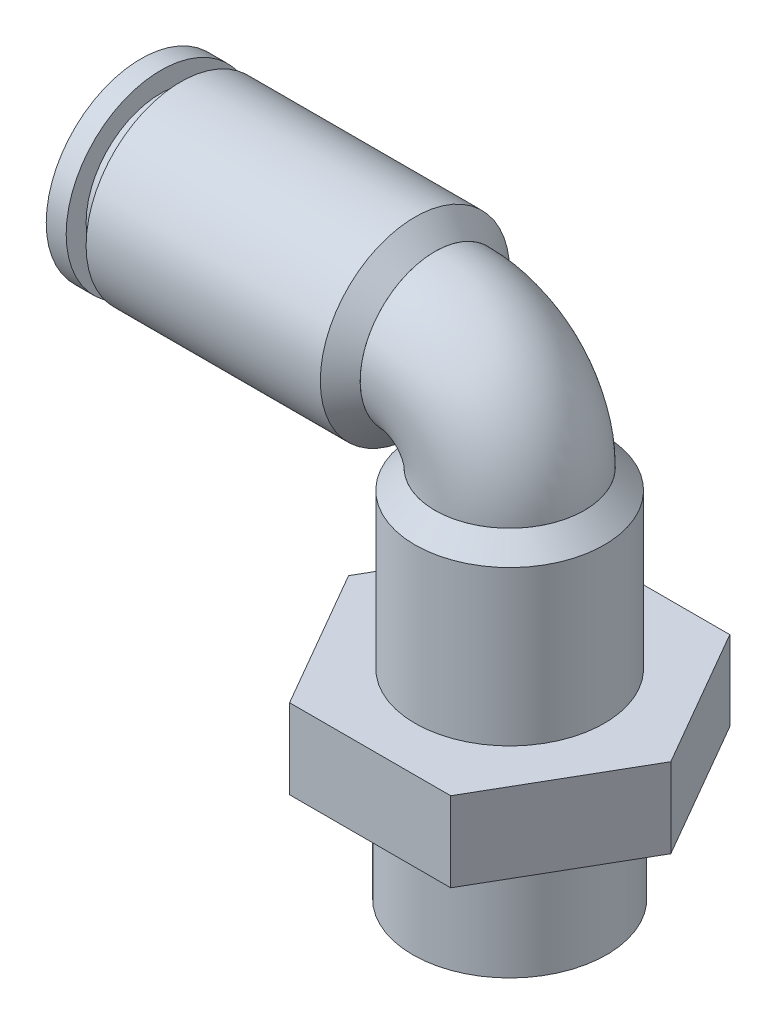
ISO-10303-21;
HEADER;
FILE_DESCRIPTION(('STEP AP214'),'2;1');
FILE_NAME('part.step','',(''),(''),'','','');
FILE_SCHEMA(('AUTOMOTIVE_DESIGN { 1 0 10303 214 1 1 1 1 }'));
ENDSEC;
DATA;
#1=APPLICATION_CONTEXT('core data for automotive mechanical design processes');
#2=APPLICATION_PROTOCOL_DEFINITION('international standard','automotive_design',2000,#1);
#3=PRODUCT_CONTEXT('',#1,'mechanical');
#4=PRODUCT('Part','Part','',(#3));
#5=PRODUCT_RELATED_PRODUCT_CATEGORY('part','',(#4));
#6=PRODUCT_DEFINITION_FORMATION('','',#4);
#7=PRODUCT_DEFINITION_CONTEXT('part definition',#1,'design');
#8=PRODUCT_DEFINITION('design','',#6,#7);
#9=PRODUCT_DEFINITION_SHAPE('','',#8);
#10=(LENGTH_UNIT() NAMED_UNIT(*) SI_UNIT(.MILLI.,.METRE.));
#11=(NAMED_UNIT(*) PLANE_ANGLE_UNIT() SI_UNIT($,.RADIAN.));
#12=(NAMED_UNIT(*) SI_UNIT($,.STERADIAN.) SOLID_ANGLE_UNIT());
#13=UNCERTAINTY_MEASURE_WITH_UNIT(LENGTH_MEASURE(1.E-05),#10,'distance_accuracy_value','');
#14=(GEOMETRIC_REPRESENTATION_CONTEXT(3) GLOBAL_UNCERTAINTY_ASSIGNED_CONTEXT((#13)) GLOBAL_UNIT_ASSIGNED_CONTEXT((#10,
#11,#12)) REPRESENTATION_CONTEXT('',''));
#15=CARTESIAN_POINT('',(0.,0.,0.));
#16=DIRECTION('',(0.,0.,1.));
#17=DIRECTION('',(1.,0.,0.));
#18=AXIS2_PLACEMENT_3D('',#15,#16,#17);
#19=CARTESIAN_POINT('',(-18.5,0.,0.));
#20=DIRECTION('',(-1.,0.,0.));
#21=DIRECTION('',(0.,0.,1.));
#22=AXIS2_PLACEMENT_3D('',#19,#20,#21);
#23=CYLINDRICAL_SURFACE('',#22,4.75);
#24=CARTESIAN_POINT('',(-17.5,0.,0.));
#25=DIRECTION('',(-1.,0.,0.));
#26=DIRECTION('',(0.,0.,1.));
#27=AXIS2_PLACEMENT_3D('',#24,#25,#26);
#28=CIRCLE('',#27,4.75);
#29=CARTESIAN_POINT('',(-17.5,0.,4.75));
#30=VERTEX_POINT('',#29);
#31=EDGE_CURVE('P0_E10',#30,#30,#28,.T.);
#32=ORIENTED_EDGE('',*,*,#31,.T.);
#33=EDGE_LOOP('',(#32));
#34=FACE_BOUND('',#33,.T.);
#35=CARTESIAN_POINT('',(-18.5,0.,0.));
#36=DIRECTION('',(-1.,0.,0.));
#37=DIRECTION('',(0.,0.,1.));
#38=AXIS2_PLACEMENT_3D('',#35,#36,#37);
#39=CIRCLE('',#38,4.75);
#40=CARTESIAN_POINT('',(-18.5,0.,4.75));
#41=VERTEX_POINT('',#40);
#42=EDGE_CURVE('P0_E39',#41,#41,#39,.T.);
#43=ORIENTED_EDGE('',*,*,#42,.F.);
#44=EDGE_LOOP('',(#43));
#45=FACE_BOUND('',#44,.T.);
#46=ADVANCED_FACE('P0_F14',(#34,#45),#23,.T.);
#47=CARTESIAN_POINT('',(-17.5,-4.75,0.));
#48=DIRECTION('',(1.,0.,0.));
#49=DIRECTION('',(0.,0.,-1.));
#50=AXIS2_PLACEMENT_3D('',#47,#48,#49);
#51=PLANE('',#50);
#52=CARTESIAN_POINT('',(-17.5,0.,0.));
#53=DIRECTION('',(-1.,0.,0.));
#54=DIRECTION('',(0.,0.,1.));
#55=AXIS2_PLACEMENT_3D('',#52,#53,#54);
#56=CIRCLE('',#55,3.75);
#57=CARTESIAN_POINT('',(-17.5,0.,3.75));
#58=VERTEX_POINT('',#57);
#59=EDGE_CURVE('P0_E20',#58,#58,#56,.T.);
#60=ORIENTED_EDGE('',*,*,#59,.T.);
#61=EDGE_LOOP('',(#60));
#62=FACE_BOUND('',#61,.T.);
#63=ORIENTED_EDGE('',*,*,#31,.F.);
#64=EDGE_LOOP('',(#63));
#65=FACE_BOUND('',#64,.T.);
#66=ADVANCED_FACE('P0_F59',(#62,#65),#51,.T.);
#67=CARTESIAN_POINT('',(-18.5,0.,0.));
#68=DIRECTION('',(-1.,0.,0.));
#69=DIRECTION('',(0.,0.,1.));
#70=AXIS2_PLACEMENT_3D('',#67,#68,#69);
#71=CYLINDRICAL_SURFACE('',#70,3.75);
#72=CARTESIAN_POINT('',(-16.5,0.,0.));
#73=DIRECTION('',(-1.,0.,0.));
#74=DIRECTION('',(0.,0.,1.));
#75=AXIS2_PLACEMENT_3D('',#72,#73,#74);
#76=CIRCLE('',#75,3.75);
#77=CARTESIAN_POINT('',(-16.5,0.,3.75));
#78=VERTEX_POINT('',#77);
#79=EDGE_CURVE('P0_E24',#78,#78,#76,.T.);
#80=ORIENTED_EDGE('',*,*,#79,.T.);
#81=EDGE_LOOP('',(#80));
#82=FACE_BOUND('',#81,.T.);
#83=ORIENTED_EDGE('',*,*,#59,.F.);
#84=EDGE_LOOP('',(#83));
#85=FACE_BOUND('',#84,.T.);
#86=ADVANCED_FACE('P0_F64',(#82,#85),#71,.T.);
#87=CARTESIAN_POINT('',(-16.5,-3.75,0.));
#88=DIRECTION('',(-1.,0.,0.));
#89=DIRECTION('',(0.,0.,1.));
#90=AXIS2_PLACEMENT_3D('',#87,#88,#89);
#91=PLANE('',#90);
#92=CARTESIAN_POINT('',(-16.5,0.,0.));
#93=DIRECTION('',(-1.,0.,0.));
#94=DIRECTION('',(0.,0.,1.));
#95=AXIS2_PLACEMENT_3D('',#92,#93,#94);
#96=CIRCLE('',#95,4.75);
#97=CARTESIAN_POINT('',(-16.5,0.,4.75));
#98=VERTEX_POINT('',#97);
#99=EDGE_CURVE('P0_E28',#98,#98,#96,.T.);
#100=ORIENTED_EDGE('',*,*,#99,.T.);
#101=EDGE_LOOP('',(#100));
#102=FACE_BOUND('',#101,.T.);
#103=ORIENTED_EDGE('',*,*,#79,.F.);
#104=EDGE_LOOP('',(#103));
#105=FACE_BOUND('',#104,.T.);
#106=ADVANCED_FACE('P0_F68',(#102,#105),#91,.T.);
#107=CARTESIAN_POINT('',(-18.5,0.,0.));
#108=DIRECTION('',(-1.,0.,0.));
#109=DIRECTION('',(0.,0.,1.));
#110=AXIS2_PLACEMENT_3D('',#107,#108,#109);
#111=CYLINDRICAL_SURFACE('',#110,4.75);
#112=CARTESIAN_POINT('',(-4.75,0.,0.));
#113=DIRECTION('',(-1.,0.,0.));
#114=DIRECTION('',(0.,0.,1.));
#115=AXIS2_PLACEMENT_3D('',#112,#113,#114);
#116=CIRCLE('',#115,4.75);
#117=CARTESIAN_POINT('',(-4.75,0.,4.75));
#118=VERTEX_POINT('',#117);
#119=EDGE_CURVE('P0_E33',#118,#118,#116,.T.);
#120=ORIENTED_EDGE('',*,*,#119,.T.);
#121=EDGE_LOOP('',(#120));
#122=FACE_BOUND('',#121,.T.);
#123=ORIENTED_EDGE('',*,*,#99,.F.);
#124=EDGE_LOOP('',(#123));
#125=FACE_BOUND('',#124,.T.);
#126=ADVANCED_FACE('P0_F75',(#122,#125),#111,.T.);
#127=CARTESIAN_POINT('',(-4.75,0.,0.));
#128=DIRECTION('',(-1.,0.,0.));
#129=DIRECTION('',(0.,0.,1.));
#130=AXIS2_PLACEMENT_3D('',#127,#128,#129);
#131=CONICAL_SURFACE('',#130,4.75,0.78539816339745);
#132=CARTESIAN_POINT('',(-3.75,0.,0.));
#133=DIRECTION('',(-1.,0.,0.));
#134=DIRECTION('',(0.,0.,1.));
#135=AXIS2_PLACEMENT_3D('',#132,#133,#134);
#136=CIRCLE('',#135,3.75);
#137=CARTESIAN_POINT('',(-3.75,0.,3.75));
#138=VERTEX_POINT('',#137);
#139=EDGE_CURVE('P0_E36',#138,#138,#136,.T.);
#140=ORIENTED_EDGE('',*,*,#139,.T.);
#141=EDGE_LOOP('',(#140));
#142=FACE_BOUND('',#141,.T.);
#143=ORIENTED_EDGE('',*,*,#119,.F.);
#144=EDGE_LOOP('',(#143));
#145=FACE_BOUND('',#144,.T.);
#146=ADVANCED_FACE('P0_F79',(#142,#145),#131,.T.);
#147=CARTESIAN_POINT('',(-3.75,-3.75,0.));
#148=DIRECTION('',(1.,0.,0.));
#149=DIRECTION('',(0.,0.,-1.));
#150=AXIS2_PLACEMENT_3D('',#147,#148,#149);
#151=PLANE('',#150);
#152=CARTESIAN_POINT('',(-3.75,0.,0.));
#153=DIRECTION('',(1.,0.,0.));
#154=DIRECTION('',(0.,0.,-1.));
#155=AXIS2_PLACEMENT_3D('',#152,#153,#154);
#156=CIRCLE('',#155,2.);
#157=CARTESIAN_POINT('',(-3.75,0.,-2.));
#158=VERTEX_POINT('',#157);
#159=EDGE_CURVE('P0_E42',#158,#158,#156,.T.);
#160=ORIENTED_EDGE('',*,*,#159,.F.);
#161=EDGE_LOOP('',(#160));
#162=FACE_BOUND('',#161,.T.);
#163=ORIENTED_EDGE('',*,*,#139,.F.);
#164=EDGE_LOOP('',(#163));
#165=FACE_BOUND('',#164,.T.);
#166=ADVANCED_FACE('P0_F54',(#162,#165),#151,.T.);
#167=CARTESIAN_POINT('',(-18.5,0.,0.));
#168=DIRECTION('',(-1.,0.,0.));
#169=DIRECTION('',(0.,0.,1.));
#170=AXIS2_PLACEMENT_3D('',#167,#168,#169);
#171=PLANE('',#170);
#172=CARTESIAN_POINT('',(-18.5,0.,0.));
#173=DIRECTION('',(-1.,0.,0.));
#174=DIRECTION('',(0.,0.,1.));
#175=AXIS2_PLACEMENT_3D('',#172,#173,#174);
#176=CIRCLE('',#175,2.);
#177=CARTESIAN_POINT('',(-18.5,0.,2.));
#178=VERTEX_POINT('',#177);
#179=EDGE_CURVE('P0_E45',#178,#178,#176,.T.);
#180=ORIENTED_EDGE('',*,*,#179,.F.);
#181=EDGE_LOOP('',(#180));
#182=FACE_BOUND('',#181,.T.);
#183=ORIENTED_EDGE('',*,*,#42,.T.);
#184=EDGE_LOOP('',(#183));
#185=FACE_BOUND('',#184,.T.);
#186=ADVANCED_FACE('P0_F51',(#182,#185),#171,.T.);
#187=CARTESIAN_POINT('',(-1.5,0.,0.));
#188=DIRECTION('',(-1.,0.,0.));
#189=DIRECTION('',(0.,0.,1.));
#190=AXIS2_PLACEMENT_3D('',#187,#188,#189);
#191=CYLINDRICAL_SURFACE('',#190,2.);
#192=ORIENTED_EDGE('',*,*,#159,.T.);
#193=EDGE_LOOP('',(#192));
#194=FACE_BOUND('',#193,.T.);
#195=ORIENTED_EDGE('',*,*,#179,.T.);
#196=EDGE_LOOP('',(#195));
#197=FACE_BOUND('',#196,.T.);
#198=ADVANCED_FACE('P0_F49',(#194,#197),#191,.F.);
#199=CLOSED_SHELL('',(#46,#66,#86,#106,#126,#146,#166,#186,#198));
#200=MANIFOLD_SOLID_BREP('P0_B1',#199);
#201=CARTESIAN_POINT('',(-9.,-16.5,0.));
#202=DIRECTION('',(0.,-1.,0.));
#203=DIRECTION('',(0.,0.,-1.));
#204=AXIS2_PLACEMENT_3D('',#201,#202,#203);
#205=PLANE('',#204);
#206=CARTESIAN_POINT('',(0.,-16.5,0.));
#207=DIRECTION('',(0.,1.,0.));
#208=DIRECTION('',(0.,0.,1.));
#209=AXIS2_PLACEMENT_3D('',#206,#207,#208);
#210=CIRCLE('',#209,4.864);
#211=CARTESIAN_POINT('',(0.,-16.5,4.864));
#212=VERTEX_POINT('',#211);
#213=EDGE_CURVE('P1_E25',#212,#212,#210,.T.);
#214=ORIENTED_EDGE('',*,*,#213,.T.);
#215=EDGE_LOOP('',(#214));
#216=FACE_BOUND('',#215,.T.);
#217=DIRECTION('',(1.,0.,0.));
#218=VECTOR('',#217,1.);
#219=CARTESIAN_POINT('',(-4.04145188432738,-16.5,-7.));
#220=LINE('',#219,#218);
#221=CARTESIAN_POINT('',(-4.04145188432738,-16.5,-7.));
#222=VERTEX_POINT('',#221);
#223=CARTESIAN_POINT('',(4.04145188432738,-16.5,-7.));
#224=VERTEX_POINT('',#223);
#225=EDGE_CURVE('P1_E106',#222,#224,#220,.T.);
#226=ORIENTED_EDGE('',*,*,#225,.T.);
#227=DIRECTION('',(0.5,0.,0.866025403784439));
#228=VECTOR('',#227,1.);
#229=CARTESIAN_POINT('',(4.04145188432738,-16.5,-7.));
#230=LINE('',#229,#228);
#231=CARTESIAN_POINT('',(8.08290376865476,-16.5,0.));
#232=VERTEX_POINT('',#231);
#233=EDGE_CURVE('P1_E72',#224,#232,#230,.T.);
#234=ORIENTED_EDGE('',*,*,#233,.T.);
#235=DIRECTION('',(-0.5,0.,0.866025403784438));
#236=VECTOR('',#235,1.);
#237=CARTESIAN_POINT('',(8.08290376865476,-16.5,0.));
#238=LINE('',#237,#236);
#239=CARTESIAN_POINT('',(4.04145188432738,-16.5,7.));
#240=VERTEX_POINT('',#239);
#241=EDGE_CURVE('P1_E84',#232,#240,#238,.T.);
#242=ORIENTED_EDGE('',*,*,#241,.T.);
#243=DIRECTION('',(-1.,0.,0.));
#244=VECTOR('',#243,1.);
#245=CARTESIAN_POINT('',(4.04145188432738,-16.5,7.));
#246=LINE('',#245,#244);
#247=CARTESIAN_POINT('',(-4.04145188432738,-16.5,7.));
#248=VERTEX_POINT('',#247);
#249=EDGE_CURVE('P1_E32',#240,#248,#246,.T.);
#250=ORIENTED_EDGE('',*,*,#249,.T.);
#251=DIRECTION('',(-0.5,0.,-0.866025403784439));
#252=VECTOR('',#251,1.);
#253=CARTESIAN_POINT('',(-4.04145188432738,-16.5,7.));
#254=LINE('',#253,#252);
#255=CARTESIAN_POINT('',(-8.08290376865476,-16.5,0.));
#256=VERTEX_POINT('',#255);
#257=EDGE_CURVE('P1_E112',#248,#256,#254,.T.);
#258=ORIENTED_EDGE('',*,*,#257,.T.);
#259=DIRECTION('',(0.5,0.,-0.866025403784438));
#260=VECTOR('',#259,1.);
#261=CARTESIAN_POINT('',(-8.08290376865476,-16.5,0.));
#262=LINE('',#261,#260);
#263=EDGE_CURVE('P1_E109',#256,#222,#262,.T.);
#264=ORIENTED_EDGE('',*,*,#263,.T.);
#265=EDGE_LOOP('',(#226,#234,#242,#250,#258,#264));
#266=FACE_BOUND('',#265,.T.);
#267=ADVANCED_FACE('P1_F16',(#216,#266),#205,.T.);
#268=CARTESIAN_POINT('',(-4.75,-12.5,0.));
#269=DIRECTION('',(0.,1.,0.));
#270=DIRECTION('',(0.,0.,1.));
#271=AXIS2_PLACEMENT_3D('',#268,#269,#270);
#272=PLANE('',#271);
#273=CARTESIAN_POINT('',(0.,-12.5,0.));
#274=DIRECTION('',(0.,1.,0.));
#275=DIRECTION('',(0.,0.,1.));
#276=AXIS2_PLACEMENT_3D('',#273,#274,#275);
#277=CIRCLE('',#276,4.75);
#278=CARTESIAN_POINT('',(0.,-12.5,4.75));
#279=VERTEX_POINT('',#278);
#280=EDGE_CURVE('P1_E125',#279,#279,#277,.T.);
#281=ORIENTED_EDGE('',*,*,#280,.F.);
#282=EDGE_LOOP('',(#281));
#283=FACE_BOUND('',#282,.T.);
#284=DIRECTION('',(-0.5,0.,0.866025403784439));
#285=VECTOR('',#284,1.);
#286=CARTESIAN_POINT('',(8.08290376865476,-12.5,0.));
#287=LINE('',#286,#285);
#288=CARTESIAN_POINT('',(8.08290376865476,-12.5,0.));
#289=VERTEX_POINT('',#288);
#290=CARTESIAN_POINT('',(4.04145188432738,-12.5,7.));
#291=VERTEX_POINT('',#290);
#292=EDGE_CURVE('P1_E90',#289,#291,#287,.T.);
#293=ORIENTED_EDGE('',*,*,#292,.F.);
#294=DIRECTION('',(0.5,0.,0.866025403784439));
#295=VECTOR('',#294,1.);
#296=CARTESIAN_POINT('',(4.04145188432738,-12.5,-7.));
#297=LINE('',#296,#295);
#298=CARTESIAN_POINT('',(4.04145188432738,-12.5,-7.));
#299=VERTEX_POINT('',#298);
#300=EDGE_CURVE('P1_E40',#299,#289,#297,.T.);
#301=ORIENTED_EDGE('',*,*,#300,.F.);
#302=DIRECTION('',(1.,0.,0.));
#303=VECTOR('',#302,1.);
#304=CARTESIAN_POINT('',(-4.04145188432739,-12.5,-7.));
#305=LINE('',#304,#303);
#306=CARTESIAN_POINT('',(-4.04145188432738,-12.5,-7.));
#307=VERTEX_POINT('',#306);
#308=EDGE_CURVE('P1_E78',#307,#299,#305,.T.);
#309=ORIENTED_EDGE('',*,*,#308,.F.);
#310=DIRECTION('',(0.5,0.,-0.866025403784439));
#311=VECTOR('',#310,1.);
#312=CARTESIAN_POINT('',(-8.08290376865476,-12.5,0.));
#313=LINE('',#312,#311);
#314=CARTESIAN_POINT('',(-8.08290376865476,-12.5,0.));
#315=VERTEX_POINT('',#314);
#316=EDGE_CURVE('P1_E97',#315,#307,#313,.T.);
#317=ORIENTED_EDGE('',*,*,#316,.F.);
#318=DIRECTION('',(-0.5,0.,-0.866025403784439));
#319=VECTOR('',#318,1.);
#320=CARTESIAN_POINT('',(-4.04145188432738,-12.5,7.));
#321=LINE('',#320,#319);
#322=CARTESIAN_POINT('',(-4.04145188432738,-12.5,7.));
#323=VERTEX_POINT('',#322);
#324=EDGE_CURVE('P1_E100',#323,#315,#321,.T.);
#325=ORIENTED_EDGE('',*,*,#324,.F.);
#326=DIRECTION('',(-1.,0.,0.));
#327=VECTOR('',#326,1.);
#328=CARTESIAN_POINT('',(4.04145188432737,-12.5,7.));
#329=LINE('',#328,#327);
#330=EDGE_CURVE('P1_E92',#291,#323,#329,.T.);
#331=ORIENTED_EDGE('',*,*,#330,.F.);
#332=EDGE_LOOP('',(#293,#301,#309,#317,#325,#331));
#333=FACE_BOUND('',#332,.T.);
#334=ADVANCED_FACE('P1_F87',(#283,#333),#272,.T.);
#335=CARTESIAN_POINT('',(-4.864,-22.5,0.));
#336=DIRECTION('',(0.,-1.,0.));
#337=DIRECTION('',(0.,0.,-1.));
#338=AXIS2_PLACEMENT_3D('',#335,#336,#337);
#339=PLANE('',#338);
#340=CARTESIAN_POINT('',(0.,-22.5,0.));
#341=DIRECTION('',(0.,1.,0.));
#342=DIRECTION('',(0.,0.,1.));
#343=AXIS2_PLACEMENT_3D('',#340,#341,#342);
#344=CIRCLE('',#343,1.5);
#345=CARTESIAN_POINT('',(0.,-22.5,1.5));
#346=VERTEX_POINT('',#345);
#347=EDGE_CURVE('P1_E99',#346,#346,#344,.T.);
#348=ORIENTED_EDGE('',*,*,#347,.T.);
#349=EDGE_LOOP('',(#348));
#350=FACE_BOUND('',#349,.T.);
#351=CARTESIAN_POINT('',(0.,-22.5,0.));
#352=DIRECTION('',(0.,1.,0.));
#353=DIRECTION('',(0.,0.,1.));
#354=AXIS2_PLACEMENT_3D('',#351,#352,#353);
#355=CIRCLE('',#354,4.864);
#356=CARTESIAN_POINT('',(0.,-22.5,4.864));
#357=VERTEX_POINT('',#356);
#358=EDGE_CURVE('P1_E11',#357,#357,#355,.T.);
#359=ORIENTED_EDGE('',*,*,#358,.F.);
#360=EDGE_LOOP('',(#359));
#361=FACE_BOUND('',#360,.T.);
#362=ADVANCED_FACE('P1_F18',(#350,#361),#339,.T.);
#363=CARTESIAN_POINT('',(0.,0.,0.));
#364=DIRECTION('',(0.,1.,0.));
#365=DIRECTION('',(0.,0.,1.));
#366=AXIS2_PLACEMENT_3D('',#363,#364,#365);
#367=CYLINDRICAL_SURFACE('',#366,4.864);
#368=ORIENTED_EDGE('',*,*,#358,.T.);
#369=EDGE_LOOP('',(#368));
#370=FACE_BOUND('',#369,.T.);
#371=ORIENTED_EDGE('',*,*,#213,.F.);
#372=EDGE_LOOP('',(#371));
#373=FACE_BOUND('',#372,.T.);
#374=ADVANCED_FACE('P1_F133',(#370,#373),#367,.T.);
#375=CARTESIAN_POINT('',(0.,0.,0.));
#376=DIRECTION('',(0.,1.,0.));
#377=DIRECTION('',(0.,0.,1.));
#378=AXIS2_PLACEMENT_3D('',#375,#376,#377);
#379=CYLINDRICAL_SURFACE('',#378,4.75);
#380=ORIENTED_EDGE('',*,*,#280,.T.);
#381=EDGE_LOOP('',(#380));
#382=FACE_BOUND('',#381,.T.);
#383=CARTESIAN_POINT('',(0.,-4.75,0.));
#384=DIRECTION('',(0.,1.,0.));
#385=DIRECTION('',(0.,0.,1.));
#386=AXIS2_PLACEMENT_3D('',#383,#384,#385);
#387=CIRCLE('',#386,4.75);
#388=CARTESIAN_POINT('',(0.,-4.75,4.75));
#389=VERTEX_POINT('',#388);
#390=EDGE_CURVE('P1_E122',#389,#389,#387,.T.);
#391=ORIENTED_EDGE('',*,*,#390,.F.);
#392=EDGE_LOOP('',(#391));
#393=FACE_BOUND('',#392,.T.);
#394=ADVANCED_FACE('P1_F135',(#382,#393),#379,.T.);
#395=CARTESIAN_POINT('',(0.,-3.75,0.));
#396=DIRECTION('',(0.,-1.,0.));
#397=DIRECTION('',(0.,0.,-1.));
#398=AXIS2_PLACEMENT_3D('',#395,#396,#397);
#399=CONICAL_SURFACE('',#398,3.75,0.785398163397447);
#400=ORIENTED_EDGE('',*,*,#390,.T.);
#401=EDGE_LOOP('',(#400));
#402=FACE_BOUND('',#401,.T.);
#403=CARTESIAN_POINT('',(0.,-3.75,0.));
#404=DIRECTION('',(0.,1.,0.));
#405=DIRECTION('',(0.,0.,1.));
#406=AXIS2_PLACEMENT_3D('',#403,#404,#405);
#407=CIRCLE('',#406,3.75);
#408=CARTESIAN_POINT('',(0.,-3.75,3.75));
#409=VERTEX_POINT('',#408);
#410=EDGE_CURVE('P1_E119',#409,#409,#407,.T.);
#411=ORIENTED_EDGE('',*,*,#410,.F.);
#412=EDGE_LOOP('',(#411));
#413=FACE_BOUND('',#412,.T.);
#414=ADVANCED_FACE('P1_F142',(#402,#413),#399,.T.);
#415=CARTESIAN_POINT('',(0.,-3.75,0.));
#416=DIRECTION('',(0.,1.,0.));
#417=DIRECTION('',(0.,0.,1.));
#418=AXIS2_PLACEMENT_3D('',#415,#416,#417);
#419=PLANE('',#418);
#420=CARTESIAN_POINT('',(0.,-3.75,0.));
#421=DIRECTION('',(0.,1.,0.));
#422=DIRECTION('',(0.,0.,1.));
#423=AXIS2_PLACEMENT_3D('',#420,#421,#422);
#424=CIRCLE('',#423,1.5);
#425=CARTESIAN_POINT('',(0.,-3.75,1.5));
#426=VERTEX_POINT('',#425);
#427=EDGE_CURVE('P1_E20',#426,#426,#424,.F.);
#428=ORIENTED_EDGE('',*,*,#427,.T.);
#429=EDGE_LOOP('',(#428));
#430=FACE_BOUND('',#429,.T.);
#431=ORIENTED_EDGE('',*,*,#410,.T.);
#432=EDGE_LOOP('',(#431));
#433=FACE_BOUND('',#432,.T.);
#434=ADVANCED_FACE('P1_F156',(#430,#433),#419,.T.);
#435=CARTESIAN_POINT('',(0.,-3.,0.));
#436=DIRECTION('',(0.,-1.,0.));
#437=DIRECTION('',(1.,0.,0.));
#438=AXIS2_PLACEMENT_3D('',#435,#436,#437);
#439=CYLINDRICAL_SURFACE('',#438,1.5);
#440=ORIENTED_EDGE('',*,*,#427,.F.);
#441=EDGE_LOOP('',(#440));
#442=FACE_BOUND('',#441,.T.);
#443=ORIENTED_EDGE('',*,*,#347,.F.);
#444=EDGE_LOOP('',(#443));
#445=FACE_BOUND('',#444,.T.);
#446=ADVANCED_FACE('P1_F160',(#442,#445),#439,.F.);
#447=CARTESIAN_POINT('',(4.04145188432738,20.6958284276805,-7.));
#448=DIRECTION('',(0.866025403784439,0.,-0.5));
#449=DIRECTION('',(-0.5,0.,-0.866025403784439));
#450=AXIS2_PLACEMENT_3D('',#447,#448,#449);
#451=PLANE('',#450);
#452=ORIENTED_EDGE('',*,*,#300,.T.);
#453=DIRECTION('',(0.,-1.,0.));
#454=VECTOR('',#453,1.);
#455=CARTESIAN_POINT('',(8.08290376865475,20.6958284276805,0.));
#456=LINE('',#455,#454);
#457=EDGE_CURVE('P1_E115',#289,#232,#456,.T.);
#458=ORIENTED_EDGE('',*,*,#457,.T.);
#459=ORIENTED_EDGE('',*,*,#233,.F.);
#460=DIRECTION('',(0.,-1.,0.));
#461=VECTOR('',#460,1.);
#462=CARTESIAN_POINT('',(4.04145188432738,20.6958284276805,-7.));
#463=LINE('',#462,#461);
#464=EDGE_CURVE('P1_E68',#299,#224,#463,.T.);
#465=ORIENTED_EDGE('',*,*,#464,.F.);
#466=EDGE_LOOP('',(#452,#458,#459,#465));
#467=FACE_BOUND('',#466,.T.);
#468=ADVANCED_FACE('P1_F70',(#467),#451,.T.);
#469=CARTESIAN_POINT('',(-4.04145188432739,20.6958284276805,-7.));
#470=DIRECTION('',(0.,0.,-1.));
#471=DIRECTION('',(-1.,0.,0.));
#472=AXIS2_PLACEMENT_3D('',#469,#470,#471);
#473=PLANE('',#472);
#474=ORIENTED_EDGE('',*,*,#308,.T.);
#475=ORIENTED_EDGE('',*,*,#464,.T.);
#476=ORIENTED_EDGE('',*,*,#225,.F.);
#477=DIRECTION('',(0.,-1.,0.));
#478=VECTOR('',#477,1.);
#479=CARTESIAN_POINT('',(-4.04145188432739,20.6958284276805,-7.));
#480=LINE('',#479,#478);
#481=EDGE_CURVE('P1_E80',#307,#222,#480,.T.);
#482=ORIENTED_EDGE('',*,*,#481,.F.);
#483=EDGE_LOOP('',(#474,#475,#476,#482));
#484=FACE_BOUND('',#483,.T.);
#485=ADVANCED_FACE('P1_F79',(#484),#473,.T.);
#486=CARTESIAN_POINT('',(-8.08290376865477,20.6958284276805,0.));
#487=DIRECTION('',(-0.866025403784438,0.,-0.5));
#488=DIRECTION('',(-0.5,0.,0.866025403784439));
#489=AXIS2_PLACEMENT_3D('',#486,#487,#488);
#490=PLANE('',#489);
#491=ORIENTED_EDGE('',*,*,#316,.T.);
#492=ORIENTED_EDGE('',*,*,#481,.T.);
#493=ORIENTED_EDGE('',*,*,#263,.F.);
#494=DIRECTION('',(0.,-1.,0.));
#495=VECTOR('',#494,1.);
#496=CARTESIAN_POINT('',(-8.08290376865477,20.6958284276805,0.));
#497=LINE('',#496,#495);
#498=EDGE_CURVE('P1_E107',#315,#256,#497,.T.);
#499=ORIENTED_EDGE('',*,*,#498,.F.);
#500=EDGE_LOOP('',(#491,#492,#493,#499));
#501=FACE_BOUND('',#500,.T.);
#502=ADVANCED_FACE('P1_F169',(#501),#490,.T.);
#503=CARTESIAN_POINT('',(-4.04145188432739,20.6958284276805,7.));
#504=DIRECTION('',(-0.866025403784439,0.,0.5));
#505=DIRECTION('',(0.5,0.,0.866025403784439));
#506=AXIS2_PLACEMENT_3D('',#503,#504,#505);
#507=PLANE('',#506);
#508=ORIENTED_EDGE('',*,*,#324,.T.);
#509=ORIENTED_EDGE('',*,*,#498,.T.);
#510=ORIENTED_EDGE('',*,*,#257,.F.);
#511=DIRECTION('',(0.,-1.,0.));
#512=VECTOR('',#511,1.);
#513=CARTESIAN_POINT('',(-4.04145188432739,20.6958284276805,7.));
#514=LINE('',#513,#512);
#515=EDGE_CURVE('P1_E110',#323,#248,#514,.T.);
#516=ORIENTED_EDGE('',*,*,#515,.F.);
#517=EDGE_LOOP('',(#508,#509,#510,#516));
#518=FACE_BOUND('',#517,.T.);
#519=ADVANCED_FACE('P1_F172',(#518),#507,.T.);
#520=CARTESIAN_POINT('',(4.04145188432737,20.6958284276805,7.));
#521=DIRECTION('',(0.,0.,1.));
#522=DIRECTION('',(1.,0.,0.));
#523=AXIS2_PLACEMENT_3D('',#520,#521,#522);
#524=PLANE('',#523);
#525=ORIENTED_EDGE('',*,*,#330,.T.);
#526=ORIENTED_EDGE('',*,*,#515,.T.);
#527=ORIENTED_EDGE('',*,*,#249,.F.);
#528=DIRECTION('',(0.,-1.,0.));
#529=VECTOR('',#528,1.);
#530=CARTESIAN_POINT('',(4.04145188432737,20.6958284276805,7.));
#531=LINE('',#530,#529);
#532=EDGE_CURVE('P1_E113',#291,#240,#531,.T.);
#533=ORIENTED_EDGE('',*,*,#532,.F.);
#534=EDGE_LOOP('',(#525,#526,#527,#533));
#535=FACE_BOUND('',#534,.T.);
#536=ADVANCED_FACE('P1_F176',(#535),#524,.T.);
#537=CARTESIAN_POINT('',(8.08290376865475,20.6958284276805,0.));
#538=DIRECTION('',(0.866025403784439,0.,0.5));
#539=DIRECTION('',(0.5,0.,-0.866025403784439));
#540=AXIS2_PLACEMENT_3D('',#537,#538,#539);
#541=PLANE('',#540);
#542=ORIENTED_EDGE('',*,*,#292,.T.);
#543=ORIENTED_EDGE('',*,*,#532,.T.);
#544=ORIENTED_EDGE('',*,*,#241,.F.);
#545=ORIENTED_EDGE('',*,*,#457,.F.);
#546=EDGE_LOOP('',(#542,#543,#544,#545));
#547=FACE_BOUND('',#546,.T.);
#548=ADVANCED_FACE('P1_F180',(#547),#541,.T.);
#549=CLOSED_SHELL('',(#267,#334,#362,#374,#394,#414,#434,#446,#468,#485,#502,#519,#536,#548));
#550=MANIFOLD_SOLID_BREP('P1_B1',#549);
#551=CARTESIAN_POINT('',(-3.75,-3.75,0.));
#552=DIRECTION('',(0.,0.,1.));
#553=DIRECTION('',(1.,0.,0.));
#554=AXIS2_PLACEMENT_3D('',#551,#552,#553);
#555=TOROIDAL_SURFACE('',#554,3.75,3.749);
#556=CARTESIAN_POINT('',(0.,-3.75000000000001,0.));
#557=DIRECTION('',(0.,-1.,0.));
#558=DIRECTION('',(0.,0.,-1.));
#559=AXIS2_PLACEMENT_3D('',#556,#557,#558);
#560=CIRCLE('',#559,3.749);
#561=CARTESIAN_POINT('',(3.749,-3.75000000000003,0.));
#562=VERTEX_POINT('',#561);
#563=EDGE_CURVE('P2_E10',#562,#562,#560,.T.);
#564=CARTESIAN_POINT('',(-3.75,0.,0.));
#565=DIRECTION('',(1.,0.,0.));
#566=DIRECTION('',(0.,0.,-1.));
#567=AXIS2_PLACEMENT_3D('',#564,#565,#566);
#568=CIRCLE('',#567,3.749);
#569=CARTESIAN_POINT('',(-3.75,3.749,0.));
#570=VERTEX_POINT('',#569);
#571=EDGE_CURVE('P2_E21',#570,#570,#568,.T.);
#572=CARTESIAN_POINT('',(-3.75,-3.75,0.));
#573=DIRECTION('',(0.,0.,1.));
#574=DIRECTION('',(1.,0.,0.));
#575=AXIS2_PLACEMENT_3D('',#572,#573,#574);
#576=CIRCLE('',#575,7.499);
#577=EDGE_CURVE('',#562,#570,#576,.T.);
#578=ORIENTED_EDGE('',*,*,#563,.F.);
#579=ORIENTED_EDGE('',*,*,#571,.T.);
#580=ORIENTED_EDGE('',*,*,#577,.T.);
#581=ORIENTED_EDGE('',*,*,#577,.F.);
#582=EDGE_LOOP('',(#578,#580,#579,#581));
#583=FACE_BOUND('',#582,.T.);
#584=ADVANCED_FACE('P2_F14',(#583),#555,.T.);
#585=CARTESIAN_POINT('',(0.,-3.75000000000001,0.));
#586=DIRECTION('',(0.,-1.,0.));
#587=DIRECTION('',(0.,0.,-1.));
#588=AXIS2_PLACEMENT_3D('',#585,#586,#587);
#589=PLANE('',#588);
#590=CARTESIAN_POINT('',(0.,-3.75000000000001,0.));
#591=DIRECTION('',(0.,-1.,0.));
#592=DIRECTION('',(1.,0.,0.));
#593=AXIS2_PLACEMENT_3D('',#590,#591,#592);
#594=CIRCLE('',#593,1.5);
#595=CARTESIAN_POINT('',(1.5,-3.75000000000002,0.));
#596=VERTEX_POINT('',#595);
#597=EDGE_CURVE('P2_E17',#596,#596,#594,.F.);
#598=ORIENTED_EDGE('',*,*,#597,.T.);
#599=EDGE_LOOP('',(#598));
#600=FACE_BOUND('',#599,.T.);
#601=ORIENTED_EDGE('',*,*,#563,.T.);
#602=EDGE_LOOP('',(#601));
#603=FACE_BOUND('',#602,.T.);
#604=ADVANCED_FACE('P2_F58',(#600,#603),#589,.T.);
#605=CARTESIAN_POINT('',(-3.75,0.,0.));
#606=DIRECTION('',(1.,0.,0.));
#607=DIRECTION('',(0.,0.,-1.));
#608=AXIS2_PLACEMENT_3D('',#605,#606,#607);
#609=PLANE('',#608);
#610=CARTESIAN_POINT('',(-3.75,0.,0.));
#611=DIRECTION('',(1.,0.,0.));
#612=DIRECTION('',(0.,0.,-1.));
#613=AXIS2_PLACEMENT_3D('',#610,#611,#612);
#614=CIRCLE('',#613,1.5);
#615=CARTESIAN_POINT('',(-3.75,0.,-1.5));
#616=VERTEX_POINT('',#615);
#617=EDGE_CURVE('P2_E28',#616,#616,#614,.T.);
#618=ORIENTED_EDGE('',*,*,#617,.T.);
#619=EDGE_LOOP('',(#618));
#620=FACE_BOUND('',#619,.T.);
#621=ORIENTED_EDGE('',*,*,#571,.F.);
#622=EDGE_LOOP('',(#621));
#623=FACE_BOUND('',#622,.T.);
#624=ADVANCED_FACE('P2_F49',(#620,#623),#609,.F.);
#625=CARTESIAN_POINT('',(-3.,0.,0.));
#626=DIRECTION('',(-1.,0.,0.));
#627=DIRECTION('',(0.,-1.,0.));
#628=AXIS2_PLACEMENT_3D('',#625,#626,#627);
#629=CYLINDRICAL_SURFACE('',#628,1.5);
#630=CARTESIAN_POINT('',(-3.,0.,0.));
#631=DIRECTION('',(-1.,0.,0.));
#632=DIRECTION('',(0.,0.,1.));
#633=AXIS2_PLACEMENT_3D('',#630,#631,#632);
#634=CIRCLE('',#633,1.5);
#635=CARTESIAN_POINT('',(-3.,1.5,0.));
#636=VERTEX_POINT('',#635);
#637=EDGE_CURVE('P2_E35',#636,#636,#634,.T.);
#638=ORIENTED_EDGE('',*,*,#637,.F.);
#639=EDGE_LOOP('',(#638));
#640=FACE_BOUND('',#639,.T.);
#641=ORIENTED_EDGE('',*,*,#617,.F.);
#642=EDGE_LOOP('',(#641));
#643=FACE_BOUND('',#642,.T.);
#644=ADVANCED_FACE('P2_F45',(#640,#643),#629,.F.);
#645=CARTESIAN_POINT('',(0.,-3.,0.));
#646=DIRECTION('',(0.,-1.,0.));
#647=DIRECTION('',(1.,0.,0.));
#648=AXIS2_PLACEMENT_3D('',#645,#646,#647);
#649=CYLINDRICAL_SURFACE('',#648,1.5);
#650=ORIENTED_EDGE('',*,*,#597,.F.);
#651=EDGE_LOOP('',(#650));
#652=FACE_BOUND('',#651,.T.);
#653=CARTESIAN_POINT('',(0.,-3.,0.));
#654=DIRECTION('',(0.,1.,0.));
#655=DIRECTION('',(0.,0.,1.));
#656=AXIS2_PLACEMENT_3D('',#653,#654,#655);
#657=CIRCLE('',#656,1.5);
#658=CARTESIAN_POINT('',(1.5,-3.,0.));
#659=VERTEX_POINT('',#658);
#660=EDGE_CURVE('P2_E30',#659,#659,#657,.T.);
#661=ORIENTED_EDGE('',*,*,#660,.T.);
#662=EDGE_LOOP('',(#661));
#663=FACE_BOUND('',#662,.T.);
#664=ADVANCED_FACE('P2_F48',(#652,#663),#649,.F.);
#665=CARTESIAN_POINT('',(-3.,-3.,0.));
#666=DIRECTION('',(0.,0.,-1.));
#667=DIRECTION('',(-1.,0.,0.));
#668=AXIS2_PLACEMENT_3D('',#665,#666,#667);
#669=TOROIDAL_SURFACE('',#668,3.,1.5);
#670=CARTESIAN_POINT('',(-3.,-3.,0.));
#671=DIRECTION('',(0.,0.,-1.));
#672=DIRECTION('',(-1.,0.,0.));
#673=AXIS2_PLACEMENT_3D('',#670,#671,#672);
#674=CIRCLE('',#673,4.5);
#675=EDGE_CURVE('',#636,#659,#674,.T.);
#676=ORIENTED_EDGE('',*,*,#637,.T.);
#677=ORIENTED_EDGE('',*,*,#660,.F.);
#678=ORIENTED_EDGE('',*,*,#675,.T.);
#679=ORIENTED_EDGE('',*,*,#675,.F.);
#680=EDGE_LOOP('',(#676,#678,#677,#679));
#681=FACE_BOUND('',#680,.T.);
#682=ADVANCED_FACE('P2_F42',(#681),#669,.F.);
#683=CLOSED_SHELL('',(#584,#604,#624,#644,#664,#682));
#684=MANIFOLD_SOLID_BREP('P2_B1',#683);
#685=ADVANCED_BREP_SHAPE_REPRESENTATION('',(#18,#200,#550,#684),#14);
#686=SHAPE_DEFINITION_REPRESENTATION(#9,#685);
ENDSEC;
END-ISO-10303-21;
